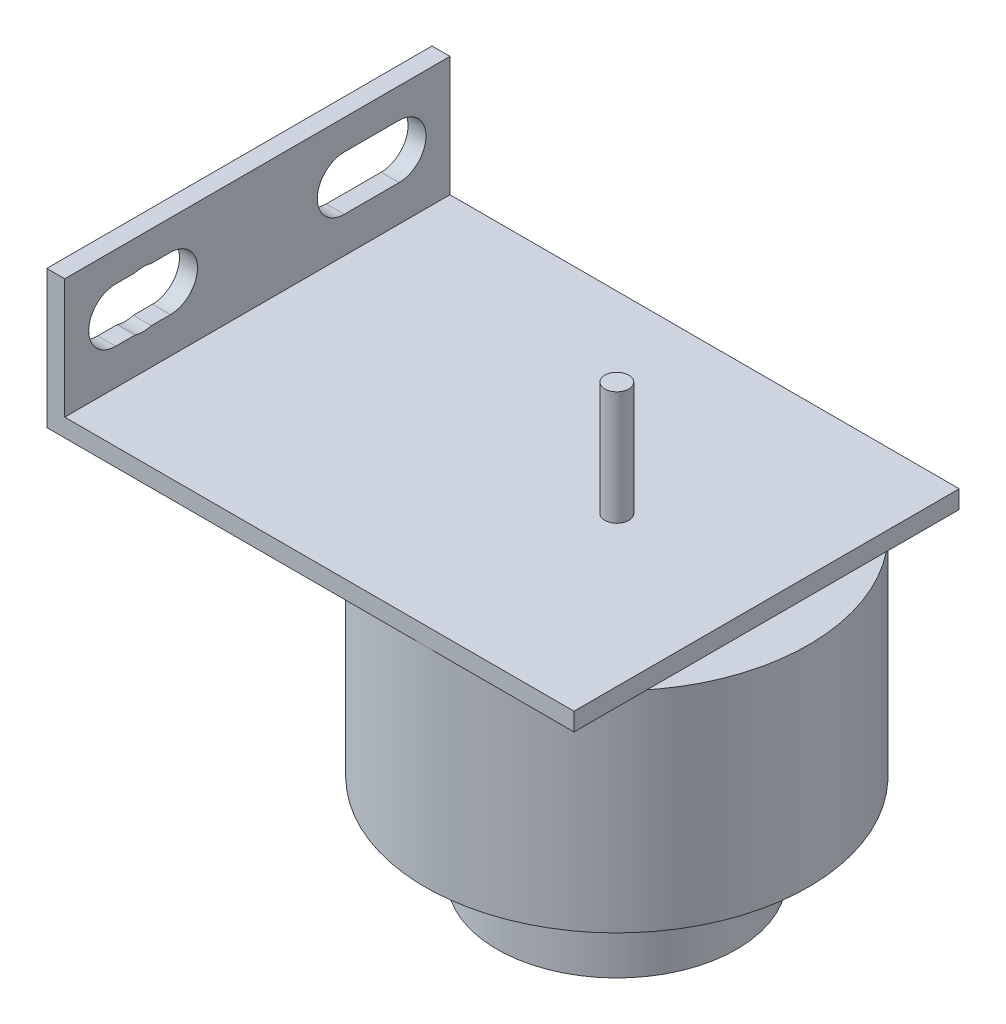
ISO-10303-21;
HEADER;
FILE_DESCRIPTION(('STEP AP214'),'2;1');
FILE_NAME('part.step','',(''),(''),'','','');
FILE_SCHEMA(('AUTOMOTIVE_DESIGN { 1 0 10303 214 1 1 1 1 }'));
ENDSEC;
DATA;
#1=APPLICATION_CONTEXT('core data for automotive mechanical design processes');
#2=APPLICATION_PROTOCOL_DEFINITION('international standard','automotive_design',2000,#1);
#3=PRODUCT_CONTEXT('',#1,'mechanical');
#4=PRODUCT('Part','Part','',(#3));
#5=PRODUCT_RELATED_PRODUCT_CATEGORY('part','',(#4));
#6=PRODUCT_DEFINITION_FORMATION('','',#4);
#7=PRODUCT_DEFINITION_CONTEXT('part definition',#1,'design');
#8=PRODUCT_DEFINITION('design','',#6,#7);
#9=PRODUCT_DEFINITION_SHAPE('','',#8);
#10=(LENGTH_UNIT() NAMED_UNIT(*) SI_UNIT(.MILLI.,.METRE.));
#11=(NAMED_UNIT(*) PLANE_ANGLE_UNIT() SI_UNIT($,.RADIAN.));
#12=(NAMED_UNIT(*) SI_UNIT($,.STERADIAN.) SOLID_ANGLE_UNIT());
#13=UNCERTAINTY_MEASURE_WITH_UNIT(LENGTH_MEASURE(1.E-05),#10,'distance_accuracy_value','');
#14=(GEOMETRIC_REPRESENTATION_CONTEXT(3) GLOBAL_UNCERTAINTY_ASSIGNED_CONTEXT((#13)) GLOBAL_UNIT_ASSIGNED_CONTEXT((#10,
#11,#12)) REPRESENTATION_CONTEXT('',''));
#15=CARTESIAN_POINT('',(0.,0.,0.));
#16=DIRECTION('',(0.,0.,1.));
#17=DIRECTION('',(1.,0.,0.));
#18=AXIS2_PLACEMENT_3D('',#15,#16,#17);
#19=CARTESIAN_POINT('',(31.5,-17.5,0.));
#20=DIRECTION('',(0.,1.,0.));
#21=DIRECTION('',(0.,0.,1.));
#22=AXIS2_PLACEMENT_3D('',#19,#20,#21);
#23=CYLINDRICAL_SURFACE('',#22,16.);
#24=CARTESIAN_POINT('',(31.5,-17.5,0.));
#25=DIRECTION('',(0.,-1.,0.));
#26=DIRECTION('',(0.,0.,-1.));
#27=AXIS2_PLACEMENT_3D('',#24,#25,#26);
#28=CIRCLE('',#27,16.);
#29=CARTESIAN_POINT('',(31.5,-17.5,-16.));
#30=VERTEX_POINT('',#29);
#31=EDGE_CURVE('E11',#30,#30,#28,.T.);
#32=ORIENTED_EDGE('',*,*,#31,.F.);
#33=EDGE_LOOP('',(#32));
#34=FACE_BOUND('',#33,.T.);
#35=CARTESIAN_POINT('',(31.5,0.,0.));
#36=DIRECTION('',(0.,-1.,0.));
#37=DIRECTION('',(0.,0.,-1.));
#38=AXIS2_PLACEMENT_3D('',#35,#36,#37);
#39=CIRCLE('',#38,16.);
#40=CARTESIAN_POINT('',(31.5,0.,-16.));
#41=VERTEX_POINT('',#40);
#42=EDGE_CURVE('E46',#41,#41,#39,.T.);
#43=ORIENTED_EDGE('',*,*,#42,.T.);
#44=EDGE_LOOP('',(#43));
#45=FACE_BOUND('',#44,.T.);
#46=ADVANCED_FACE('F43',(#34,#45),#23,.T.);
#47=CARTESIAN_POINT('',(31.5,-17.5,0.));
#48=DIRECTION('',(0.,-1.,0.));
#49=DIRECTION('',(0.,0.,-1.));
#50=AXIS2_PLACEMENT_3D('',#47,#48,#49);
#51=PLANE('',#50);
#52=CARTESIAN_POINT('',(31.5,-17.5,0.));
#53=DIRECTION('',(0.,-1.,0.));
#54=DIRECTION('',(0.,0.,-1.));
#55=AXIS2_PLACEMENT_3D('',#52,#53,#54);
#56=CIRCLE('',#55,10.);
#57=CARTESIAN_POINT('',(31.5,-17.5,-10.));
#58=VERTEX_POINT('',#57);
#59=EDGE_CURVE('E53',#58,#58,#56,.F.);
#60=ORIENTED_EDGE('',*,*,#59,.T.);
#61=EDGE_LOOP('',(#60));
#62=FACE_BOUND('',#61,.T.);
#63=ORIENTED_EDGE('',*,*,#31,.T.);
#64=EDGE_LOOP('',(#63));
#65=FACE_BOUND('',#64,.T.);
#66=ADVANCED_FACE('F73',(#62,#65),#51,.T.);
#67=CARTESIAN_POINT('',(31.5,0.,0.));
#68=DIRECTION('',(0.,-1.,0.));
#69=DIRECTION('',(0.,0.,-1.));
#70=AXIS2_PLACEMENT_3D('',#67,#68,#69);
#71=PLANE('',#70);
#72=ORIENTED_EDGE('',*,*,#42,.F.);
#73=EDGE_LOOP('',(#72));
#74=FACE_BOUND('',#73,.T.);
#75=ADVANCED_FACE('F65',(#74),#71,.F.);
#76=CARTESIAN_POINT('',(31.5,-25.,0.));
#77=DIRECTION('',(0.,1.,0.));
#78=DIRECTION('',(0.,0.,1.));
#79=AXIS2_PLACEMENT_3D('',#76,#77,#78);
#80=CYLINDRICAL_SURFACE('',#79,10.);
#81=ORIENTED_EDGE('',*,*,#59,.F.);
#82=EDGE_LOOP('',(#81));
#83=FACE_BOUND('',#82,.T.);
#84=CARTESIAN_POINT('',(31.5,-25.,0.));
#85=DIRECTION('',(0.,-1.,0.));
#86=DIRECTION('',(0.,0.,-1.));
#87=AXIS2_PLACEMENT_3D('',#84,#85,#86);
#88=CIRCLE('',#87,10.);
#89=CARTESIAN_POINT('',(31.5,-25.,-10.));
#90=VERTEX_POINT('',#89);
#91=EDGE_CURVE('E57',#90,#90,#88,.T.);
#92=ORIENTED_EDGE('',*,*,#91,.F.);
#93=EDGE_LOOP('',(#92));
#94=FACE_BOUND('',#93,.T.);
#95=ADVANCED_FACE('F63',(#83,#94),#80,.T.);
#96=CARTESIAN_POINT('',(31.5,-25.,0.));
#97=DIRECTION('',(0.,-1.,0.));
#98=DIRECTION('',(0.,0.,-1.));
#99=AXIS2_PLACEMENT_3D('',#96,#97,#98);
#100=PLANE('',#99);
#101=ORIENTED_EDGE('',*,*,#91,.T.);
#102=EDGE_LOOP('',(#101));
#103=FACE_BOUND('',#102,.T.);
#104=ADVANCED_FACE('F61',(#103),#100,.T.);
#105=CLOSED_SHELL('',(#46,#66,#75,#95,#104));
#106=MANIFOLD_SOLID_BREP('B2',#105);
#107=CARTESIAN_POINT('',(31.5,11.,0.));
#108=DIRECTION('',(0.,-1.,0.));
#109=DIRECTION('',(0.,0.,-1.));
#110=AXIS2_PLACEMENT_3D('',#107,#108,#109);
#111=CYLINDRICAL_SURFACE('',#110,0.999999999999998);
#112=CARTESIAN_POINT('',(31.5,11.,0.));
#113=DIRECTION('',(0.,1.,0.));
#114=DIRECTION('',(0.,0.,1.));
#115=AXIS2_PLACEMENT_3D('',#112,#113,#114);
#116=CIRCLE('',#115,0.999999999999998);
#117=CARTESIAN_POINT('',(31.5,11.,0.999999999999998));
#118=VERTEX_POINT('',#117);
#119=EDGE_CURVE('E42',#118,#118,#116,.T.);
#120=ORIENTED_EDGE('',*,*,#119,.F.);
#121=EDGE_LOOP('',(#120));
#122=FACE_BOUND('',#121,.T.);
#123=CARTESIAN_POINT('',(31.5,1.5,0.));
#124=DIRECTION('',(0.,1.,0.));
#125=DIRECTION('',(0.,0.,1.));
#126=AXIS2_PLACEMENT_3D('',#123,#124,#125);
#127=CIRCLE('',#126,0.999999999999998);
#128=CARTESIAN_POINT('',(31.5,1.5,0.999999999999998));
#129=VERTEX_POINT('',#128);
#130=EDGE_CURVE('E131',#129,#129,#127,.T.);
#131=ORIENTED_EDGE('',*,*,#130,.T.);
#132=EDGE_LOOP('',(#131));
#133=FACE_BOUND('',#132,.T.);
#134=ADVANCED_FACE('F128',(#122,#133),#111,.T.);
#135=CARTESIAN_POINT('',(31.5,11.,0.));
#136=DIRECTION('',(0.,1.,0.));
#137=DIRECTION('',(0.,0.,1.));
#138=AXIS2_PLACEMENT_3D('',#135,#136,#137);
#139=PLANE('',#138);
#140=ORIENTED_EDGE('',*,*,#119,.T.);
#141=EDGE_LOOP('',(#140));
#142=FACE_BOUND('',#141,.T.);
#143=ADVANCED_FACE('F143',(#142),#139,.T.);
#144=CARTESIAN_POINT('',(31.5,1.5,0.));
#145=DIRECTION('',(0.,1.,0.));
#146=DIRECTION('',(0.,0.,1.));
#147=AXIS2_PLACEMENT_3D('',#144,#145,#146);
#148=PLANE('',#147);
#149=ORIENTED_EDGE('',*,*,#130,.F.);
#150=EDGE_LOOP('',(#149));
#151=FACE_BOUND('',#150,.T.);
#152=ADVANCED_FACE('F141',(#151),#148,.F.);
#153=CLOSED_SHELL('',(#134,#143,#152));
#154=MANIFOLD_SOLID_BREP('B6',#153);
#155=CARTESIAN_POINT('',(3.,4.5,11.825));
#156=DIRECTION('',(0.,-1.,0.));
#157=DIRECTION('',(0.,0.,-1.));
#158=AXIS2_PLACEMENT_3D('',#155,#156,#157);
#159=PLANE('',#158);
#160=DIRECTION('',(0.,0.,-1.));
#161=VECTOR('',#160,1.);
#162=CARTESIAN_POINT('',(1.5,4.50000000000001,16.075));
#163=LINE('',#162,#161);
#164=CARTESIAN_POINT('',(1.5,4.5,11.825));
#165=VERTEX_POINT('',#164);
#166=CARTESIAN_POINT('',(1.5,4.5,10.2157329983124));
#167=VERTEX_POINT('',#166);
#168=EDGE_CURVE('E341',#165,#167,#163,.T.);
#169=ORIENTED_EDGE('',*,*,#168,.T.);
#170=DIRECTION('',(-1.,0.,0.));
#171=VECTOR('',#170,1.);
#172=CARTESIAN_POINT('',(47.5,4.5,10.2157329983124));
#173=LINE('',#172,#171);
#174=CARTESIAN_POINT('',(0.,4.5,10.2157329983124));
#175=VERTEX_POINT('',#174);
#176=EDGE_CURVE('E490',#167,#175,#173,.T.);
#177=ORIENTED_EDGE('',*,*,#176,.T.);
#178=DIRECTION('',(0.,0.,1.));
#179=VECTOR('',#178,1.);
#180=CARTESIAN_POINT('',(0.,4.5,11.825));
#181=LINE('',#180,#179);
#182=CARTESIAN_POINT('',(0.,4.5,11.825));
#183=VERTEX_POINT('',#182);
#184=EDGE_CURVE('E315',#175,#183,#181,.T.);
#185=ORIENTED_EDGE('',*,*,#184,.T.);
#186=DIRECTION('',(-1.,0.,0.));
#187=VECTOR('',#186,1.);
#188=CARTESIAN_POINT('',(3.,4.5,11.825));
#189=LINE('',#188,#187);
#190=EDGE_CURVE('E324',#165,#183,#189,.T.);
#191=ORIENTED_EDGE('',*,*,#190,.F.);
#192=EDGE_LOOP('',(#169,#177,#185,#191));
#193=FACE_BOUND('',#192,.T.);
#194=ADVANCED_FACE('F168',(#193),#159,.F.);
#195=CARTESIAN_POINT('',(3.,9.00000000000001,11.825));
#196=DIRECTION('',(0.,1.,0.));
#197=DIRECTION('',(0.,0.,1.));
#198=AXIS2_PLACEMENT_3D('',#195,#196,#197);
#199=PLANE('',#198);
#200=DIRECTION('',(0.,0.,1.));
#201=VECTOR('',#200,1.);
#202=CARTESIAN_POINT('',(1.5,9.00000000000001,16.075));
#203=LINE('',#202,#201);
#204=CARTESIAN_POINT('',(1.5,9.00000000000001,7.24999999999999));
#205=VERTEX_POINT('',#204);
#206=CARTESIAN_POINT('',(1.5,9.00000000000001,8.85926700168747));
#207=VERTEX_POINT('',#206);
#208=EDGE_CURVE('E334',#205,#207,#203,.T.);
#209=ORIENTED_EDGE('',*,*,#208,.T.);
#210=DIRECTION('',(-1.,0.,0.));
#211=VECTOR('',#210,1.);
#212=CARTESIAN_POINT('',(47.5,9.00000000000001,8.85926700168747));
#213=LINE('',#212,#211);
#214=CARTESIAN_POINT('',(0.,9.00000000000001,8.85926700168747));
#215=VERTEX_POINT('',#214);
#216=EDGE_CURVE('E126',#207,#215,#213,.T.);
#217=ORIENTED_EDGE('',*,*,#216,.T.);
#218=DIRECTION('',(0.,0.,-1.));
#219=VECTOR('',#218,1.);
#220=CARTESIAN_POINT('',(0.,9.00000000000001,11.825));
#221=LINE('',#220,#219);
#222=CARTESIAN_POINT('',(0.,9.00000000000001,7.24999999999999));
#223=VERTEX_POINT('',#222);
#224=EDGE_CURVE('E305',#215,#223,#221,.T.);
#225=ORIENTED_EDGE('',*,*,#224,.T.);
#226=DIRECTION('',(-1.,0.,0.));
#227=VECTOR('',#226,1.);
#228=CARTESIAN_POINT('',(3.,9.00000000000001,7.24999999999999));
#229=LINE('',#228,#227);
#230=EDGE_CURVE('E330',#205,#223,#229,.T.);
#231=ORIENTED_EDGE('',*,*,#230,.F.);
#232=EDGE_LOOP('',(#209,#217,#225,#231));
#233=FACE_BOUND('',#232,.T.);
#234=ADVANCED_FACE('F458',(#233),#199,.F.);
#235=CARTESIAN_POINT('',(0.,0.,16.075));
#236=DIRECTION('',(0.,1.,0.));
#237=DIRECTION('',(0.,0.,1.));
#238=AXIS2_PLACEMENT_3D('',#235,#236,#237);
#239=PLANE('',#238);
#240=DIRECTION('',(1.,0.,0.));
#241=VECTOR('',#240,1.);
#242=CARTESIAN_POINT('',(0.,0.,-16.075));
#243=LINE('',#242,#241);
#244=CARTESIAN_POINT('',(0.,0.,-16.075));
#245=VERTEX_POINT('',#244);
#246=CARTESIAN_POINT('',(44.,0.,-16.075));
#247=VERTEX_POINT('',#246);
#248=EDGE_CURVE('E375',#245,#247,#243,.T.);
#249=ORIENTED_EDGE('',*,*,#248,.T.);
#250=DIRECTION('',(0.,0.,-1.));
#251=VECTOR('',#250,1.);
#252=CARTESIAN_POINT('',(44.,0.,16.075));
#253=LINE('',#252,#251);
#254=CARTESIAN_POINT('',(44.,0.,16.075));
#255=VERTEX_POINT('',#254);
#256=EDGE_CURVE('E296',#255,#247,#253,.T.);
#257=ORIENTED_EDGE('',*,*,#256,.F.);
#258=DIRECTION('',(1.,0.,0.));
#259=VECTOR('',#258,1.);
#260=CARTESIAN_POINT('',(0.,0.,16.075));
#261=LINE('',#260,#259);
#262=CARTESIAN_POINT('',(0.,0.,16.075));
#263=VERTEX_POINT('',#262);
#264=EDGE_CURVE('E376',#263,#255,#261,.T.);
#265=ORIENTED_EDGE('',*,*,#264,.F.);
#266=DIRECTION('',(0.,0.,-1.));
#267=VECTOR('',#266,1.);
#268=CARTESIAN_POINT('',(0.,0.,16.075));
#269=LINE('',#268,#267);
#270=EDGE_CURVE('E393',#263,#245,#269,.T.);
#271=ORIENTED_EDGE('',*,*,#270,.T.);
#272=EDGE_LOOP('',(#249,#257,#265,#271));
#273=FACE_BOUND('',#272,.T.);
#274=ADVANCED_FACE('F170',(#273),#239,.F.);
#275=CARTESIAN_POINT('',(44.,1.5,16.075));
#276=DIRECTION('',(1.,0.,0.));
#277=DIRECTION('',(0.,0.,-1.));
#278=AXIS2_PLACEMENT_3D('',#275,#276,#277);
#279=PLANE('',#278);
#280=DIRECTION('',(0.,-1.,0.));
#281=VECTOR('',#280,1.);
#282=CARTESIAN_POINT('',(44.,1.5,-16.075));
#283=LINE('',#282,#281);
#284=CARTESIAN_POINT('',(44.,1.5,-16.075));
#285=VERTEX_POINT('',#284);
#286=EDGE_CURVE('E396',#285,#247,#283,.T.);
#287=ORIENTED_EDGE('',*,*,#286,.F.);
#288=DIRECTION('',(0.,0.,-1.));
#289=VECTOR('',#288,1.);
#290=CARTESIAN_POINT('',(44.,1.5,16.075));
#291=LINE('',#290,#289);
#292=CARTESIAN_POINT('',(44.,1.5,16.075));
#293=VERTEX_POINT('',#292);
#294=EDGE_CURVE('E417',#293,#285,#291,.T.);
#295=ORIENTED_EDGE('',*,*,#294,.F.);
#296=DIRECTION('',(0.,-1.,0.));
#297=VECTOR('',#296,1.);
#298=CARTESIAN_POINT('',(44.,1.5,16.075));
#299=LINE('',#298,#297);
#300=EDGE_CURVE('E378',#293,#255,#299,.T.);
#301=ORIENTED_EDGE('',*,*,#300,.T.);
#302=ORIENTED_EDGE('',*,*,#256,.T.);
#303=EDGE_LOOP('',(#287,#295,#301,#302));
#304=FACE_BOUND('',#303,.T.);
#305=ADVANCED_FACE('F422',(#304),#279,.T.);
#306=CARTESIAN_POINT('',(0.,1.5,16.075));
#307=DIRECTION('',(0.,1.,0.));
#308=DIRECTION('',(0.,0.,1.));
#309=AXIS2_PLACEMENT_3D('',#306,#307,#308);
#310=PLANE('',#309);
#311=DIRECTION('',(1.,0.,0.));
#312=VECTOR('',#311,1.);
#313=CARTESIAN_POINT('',(0.,1.5,-16.075));
#314=LINE('',#313,#312);
#315=CARTESIAN_POINT('',(1.5,1.5,-16.075));
#316=VERTEX_POINT('',#315);
#317=EDGE_CURVE('E399',#316,#285,#314,.T.);
#318=ORIENTED_EDGE('',*,*,#317,.F.);
#319=DIRECTION('',(0.,0.,-1.));
#320=VECTOR('',#319,1.);
#321=CARTESIAN_POINT('',(1.5,1.5,16.075));
#322=LINE('',#321,#320);
#323=CARTESIAN_POINT('',(1.5,1.5,16.075));
#324=VERTEX_POINT('',#323);
#325=EDGE_CURVE('E415',#324,#316,#322,.T.);
#326=ORIENTED_EDGE('',*,*,#325,.F.);
#327=DIRECTION('',(1.,0.,0.));
#328=VECTOR('',#327,1.);
#329=CARTESIAN_POINT('',(0.,1.5,16.075));
#330=LINE('',#329,#328);
#331=EDGE_CURVE('E382',#324,#293,#330,.T.);
#332=ORIENTED_EDGE('',*,*,#331,.T.);
#333=ORIENTED_EDGE('',*,*,#294,.T.);
#334=EDGE_LOOP('',(#318,#326,#332,#333));
#335=FACE_BOUND('',#334,.T.);
#336=ADVANCED_FACE('F434',(#335),#310,.T.);
#337=CARTESIAN_POINT('',(1.5,11.5,16.075));
#338=DIRECTION('',(1.,0.,0.));
#339=DIRECTION('',(0.,0.,-1.));
#340=AXIS2_PLACEMENT_3D('',#337,#338,#339);
#341=PLANE('',#340);
#342=CARTESIAN_POINT('',(1.5,6.75000000000003,9.5375));
#343=DIRECTION('',(1.,0.,0.));
#344=DIRECTION('',(0.,0.,-1.));
#345=AXIS2_PLACEMENT_3D('',#342,#343,#344);
#346=CIRCLE('',#345,2.34999999999999);
#347=CARTESIAN_POINT('',(1.5,9.00000000000001,10.2157329983125));
#348=VERTEX_POINT('',#347);
#349=EDGE_CURVE('E191',#207,#348,#346,.T.);
#350=ORIENTED_EDGE('',*,*,#349,.F.);
#351=ORIENTED_EDGE('',*,*,#208,.F.);
#352=CARTESIAN_POINT('',(1.5,6.75000000000003,7.24999999999999));
#353=DIRECTION('',(1.,0.,0.));
#354=DIRECTION('',(0.,0.,-1.));
#355=AXIS2_PLACEMENT_3D('',#352,#353,#354);
#356=CIRCLE('',#355,2.25);
#357=CARTESIAN_POINT('',(1.5,4.50000000000002,7.24999999999999));
#358=VERTEX_POINT('',#357);
#359=EDGE_CURVE('E337',#358,#205,#356,.T.);
#360=ORIENTED_EDGE('',*,*,#359,.F.);
#361=CARTESIAN_POINT('',(1.5,4.5,8.8592670016876));
#362=VERTEX_POINT('',#361);
#363=EDGE_CURVE('E340',#362,#358,#163,.T.);
#364=ORIENTED_EDGE('',*,*,#363,.F.);
#365=EDGE_CURVE('E183',#167,#362,#346,.T.);
#366=ORIENTED_EDGE('',*,*,#365,.F.);
#367=ORIENTED_EDGE('',*,*,#168,.F.);
#368=CARTESIAN_POINT('',(1.5,6.75000000000001,11.825));
#369=DIRECTION('',(1.,0.,0.));
#370=DIRECTION('',(0.,0.,-1.));
#371=AXIS2_PLACEMENT_3D('',#368,#369,#370);
#372=CIRCLE('',#371,2.25);
#373=CARTESIAN_POINT('',(1.5,9.00000000000001,11.825));
#374=VERTEX_POINT('',#373);
#375=EDGE_CURVE('E344',#374,#165,#372,.T.);
#376=ORIENTED_EDGE('',*,*,#375,.F.);
#377=EDGE_CURVE('E327',#348,#374,#203,.T.);
#378=ORIENTED_EDGE('',*,*,#377,.F.);
#379=EDGE_LOOP('',(#350,#351,#360,#364,#366,#367,#376,#378));
#380=FACE_BOUND('',#379,.T.);
#381=CARTESIAN_POINT('',(1.5,6.75000000000001,-11.825));
#382=DIRECTION('',(1.,0.,0.));
#383=DIRECTION('',(0.,0.,-1.));
#384=AXIS2_PLACEMENT_3D('',#381,#382,#383);
#385=CIRCLE('',#384,2.25);
#386=CARTESIAN_POINT('',(1.5,4.5,-11.825));
#387=VERTEX_POINT('',#386);
#388=CARTESIAN_POINT('',(1.5,9.00000000000001,-11.825));
#389=VERTEX_POINT('',#388);
#390=EDGE_CURVE('E373',#387,#389,#385,.T.);
#391=ORIENTED_EDGE('',*,*,#390,.F.);
#392=DIRECTION('',(0.,0.,-1.));
#393=VECTOR('',#392,1.);
#394=CARTESIAN_POINT('',(1.5,4.49999999999999,16.075));
#395=LINE('',#394,#393);
#396=CARTESIAN_POINT('',(1.5,4.5,-7.24999999999999));
#397=VERTEX_POINT('',#396);
#398=EDGE_CURVE('E360',#397,#387,#395,.T.);
#399=ORIENTED_EDGE('',*,*,#398,.F.);
#400=CARTESIAN_POINT('',(1.5,6.75000000000003,-7.24999999999999));
#401=DIRECTION('',(1.,0.,0.));
#402=DIRECTION('',(0.,0.,-1.));
#403=AXIS2_PLACEMENT_3D('',#400,#401,#402);
#404=CIRCLE('',#403,2.25);
#405=CARTESIAN_POINT('',(1.5,9.00000000000001,-7.24999999999999));
#406=VERTEX_POINT('',#405);
#407=EDGE_CURVE('E368',#406,#397,#404,.T.);
#408=ORIENTED_EDGE('',*,*,#407,.F.);
#409=DIRECTION('',(0.,0.,1.));
#410=VECTOR('',#409,1.);
#411=CARTESIAN_POINT('',(1.5,9.00000000000001,16.075));
#412=LINE('',#411,#410);
#413=EDGE_CURVE('E371',#389,#406,#412,.T.);
#414=ORIENTED_EDGE('',*,*,#413,.F.);
#415=EDGE_LOOP('',(#391,#399,#408,#414));
#416=FACE_BOUND('',#415,.T.);
#417=DIRECTION('',(0.,1.,0.));
#418=VECTOR('',#417,1.);
#419=CARTESIAN_POINT('',(1.5,11.5,-16.075));
#420=LINE('',#419,#418);
#421=CARTESIAN_POINT('',(1.5,11.5,-16.075));
#422=VERTEX_POINT('',#421);
#423=EDGE_CURVE('E402',#422,#316,#420,.F.);
#424=ORIENTED_EDGE('',*,*,#423,.F.);
#425=DIRECTION('',(0.,0.,-1.));
#426=VECTOR('',#425,1.);
#427=CARTESIAN_POINT('',(1.5,11.5,16.075));
#428=LINE('',#427,#426);
#429=CARTESIAN_POINT('',(1.5,11.5,16.075));
#430=VERTEX_POINT('',#429);
#431=EDGE_CURVE('E413',#430,#422,#428,.T.);
#432=ORIENTED_EDGE('',*,*,#431,.F.);
#433=DIRECTION('',(0.,1.,0.));
#434=VECTOR('',#433,1.);
#435=CARTESIAN_POINT('',(1.5,11.5,16.075));
#436=LINE('',#435,#434);
#437=EDGE_CURVE('E385',#430,#324,#436,.F.);
#438=ORIENTED_EDGE('',*,*,#437,.T.);
#439=ORIENTED_EDGE('',*,*,#325,.T.);
#440=EDGE_LOOP('',(#424,#432,#438,#439));
#441=FACE_BOUND('',#440,.T.);
#442=ADVANCED_FACE('F446',(#380,#416,#441),#341,.T.);
#443=CARTESIAN_POINT('',(0.,11.5,16.075));
#444=DIRECTION('',(0.,1.,0.));
#445=DIRECTION('',(0.,0.,1.));
#446=AXIS2_PLACEMENT_3D('',#443,#444,#445);
#447=PLANE('',#446);
#448=DIRECTION('',(1.,0.,0.));
#449=VECTOR('',#448,1.);
#450=CARTESIAN_POINT('',(0.,11.5,-16.075));
#451=LINE('',#450,#449);
#452=CARTESIAN_POINT('',(0.,11.5,-16.075));
#453=VERTEX_POINT('',#452);
#454=EDGE_CURVE('E405',#453,#422,#451,.T.);
#455=ORIENTED_EDGE('',*,*,#454,.F.);
#456=DIRECTION('',(0.,0.,-1.));
#457=VECTOR('',#456,1.);
#458=CARTESIAN_POINT('',(0.,11.5,16.075));
#459=LINE('',#458,#457);
#460=CARTESIAN_POINT('',(0.,11.5,16.075));
#461=VERTEX_POINT('',#460);
#462=EDGE_CURVE('E411',#461,#453,#459,.T.);
#463=ORIENTED_EDGE('',*,*,#462,.F.);
#464=DIRECTION('',(1.,0.,0.));
#465=VECTOR('',#464,1.);
#466=CARTESIAN_POINT('',(0.,11.5,16.075));
#467=LINE('',#466,#465);
#468=EDGE_CURVE('E388',#461,#430,#467,.T.);
#469=ORIENTED_EDGE('',*,*,#468,.T.);
#470=ORIENTED_EDGE('',*,*,#431,.T.);
#471=EDGE_LOOP('',(#455,#463,#469,#470));
#472=FACE_BOUND('',#471,.T.);
#473=ADVANCED_FACE('F444',(#472),#447,.T.);
#474=CARTESIAN_POINT('',(0.,11.5,16.075));
#475=DIRECTION('',(1.,0.,0.));
#476=DIRECTION('',(0.,0.,-1.));
#477=AXIS2_PLACEMENT_3D('',#474,#475,#476);
#478=PLANE('',#477);
#479=ORIENTED_EDGE('',*,*,#224,.F.);
#480=CARTESIAN_POINT('',(0.,6.75000000000003,9.5375));
#481=DIRECTION('',(-1.,0.,0.));
#482=DIRECTION('',(0.,0.,1.));
#483=AXIS2_PLACEMENT_3D('',#480,#481,#482);
#484=CIRCLE('',#483,2.34999999999999);
#485=CARTESIAN_POINT('',(0.,9.00000000000001,10.2157329983125));
#486=VERTEX_POINT('',#485);
#487=EDGE_CURVE('E292',#486,#215,#484,.T.);
#488=ORIENTED_EDGE('',*,*,#487,.F.);
#489=CARTESIAN_POINT('',(0.,9.00000000000001,11.825));
#490=VERTEX_POINT('',#489);
#491=EDGE_CURVE('E303',#490,#486,#221,.T.);
#492=ORIENTED_EDGE('',*,*,#491,.F.);
#493=CARTESIAN_POINT('',(0.,6.75000000000001,11.825));
#494=DIRECTION('',(-1.,0.,0.));
#495=DIRECTION('',(0.,0.,-1.));
#496=AXIS2_PLACEMENT_3D('',#493,#494,#495);
#497=CIRCLE('',#496,2.25);
#498=EDGE_CURVE('E317',#183,#490,#497,.T.);
#499=ORIENTED_EDGE('',*,*,#498,.F.);
#500=ORIENTED_EDGE('',*,*,#184,.F.);
#501=CARTESIAN_POINT('',(0.,4.5,8.8592670016876));
#502=VERTEX_POINT('',#501);
#503=EDGE_CURVE('E306',#502,#175,#484,.T.);
#504=ORIENTED_EDGE('',*,*,#503,.F.);
#505=CARTESIAN_POINT('',(0.,4.50000000000002,7.24999999999999));
#506=VERTEX_POINT('',#505);
#507=EDGE_CURVE('E321',#506,#502,#181,.T.);
#508=ORIENTED_EDGE('',*,*,#507,.F.);
#509=CARTESIAN_POINT('',(0.,6.75000000000003,7.24999999999999));
#510=DIRECTION('',(-1.,0.,0.));
#511=DIRECTION('',(0.,0.,-1.));
#512=AXIS2_PLACEMENT_3D('',#509,#510,#511);
#513=CIRCLE('',#512,2.25);
#514=EDGE_CURVE('E312',#223,#506,#513,.T.);
#515=ORIENTED_EDGE('',*,*,#514,.F.);
#516=EDGE_LOOP('',(#479,#488,#492,#499,#500,#504,#508,#515));
#517=FACE_BOUND('',#516,.T.);
#518=DIRECTION('',(0.,0.,1.));
#519=VECTOR('',#518,1.);
#520=CARTESIAN_POINT('',(0.,4.5,-11.825));
#521=LINE('',#520,#519);
#522=CARTESIAN_POINT('',(0.,4.5,-11.825));
#523=VERTEX_POINT('',#522);
#524=CARTESIAN_POINT('',(0.,4.50000000000002,-7.24999999999999));
#525=VERTEX_POINT('',#524);
#526=EDGE_CURVE('E348',#523,#525,#521,.T.);
#527=ORIENTED_EDGE('',*,*,#526,.F.);
#528=CARTESIAN_POINT('',(0.,6.75000000000001,-11.825));
#529=DIRECTION('',(-1.,0.,0.));
#530=DIRECTION('',(0.,0.,1.));
#531=AXIS2_PLACEMENT_3D('',#528,#529,#530);
#532=CIRCLE('',#531,2.25);
#533=CARTESIAN_POINT('',(0.,9.00000000000001,-11.825));
#534=VERTEX_POINT('',#533);
#535=EDGE_CURVE('E346',#534,#523,#532,.T.);
#536=ORIENTED_EDGE('',*,*,#535,.F.);
#537=DIRECTION('',(0.,0.,-1.));
#538=VECTOR('',#537,1.);
#539=CARTESIAN_POINT('',(0.,9.00000000000001,-11.825));
#540=LINE('',#539,#538);
#541=CARTESIAN_POINT('',(0.,9.00000000000001,-7.24999999999999));
#542=VERTEX_POINT('',#541);
#543=EDGE_CURVE('E354',#542,#534,#540,.T.);
#544=ORIENTED_EDGE('',*,*,#543,.F.);
#545=CARTESIAN_POINT('',(0.,6.75000000000003,-7.24999999999999));
#546=DIRECTION('',(-1.,0.,0.));
#547=DIRECTION('',(0.,0.,1.));
#548=AXIS2_PLACEMENT_3D('',#545,#546,#547);
#549=CIRCLE('',#548,2.25);
#550=EDGE_CURVE('E351',#525,#542,#549,.T.);
#551=ORIENTED_EDGE('',*,*,#550,.F.);
#552=EDGE_LOOP('',(#527,#536,#544,#551));
#553=FACE_BOUND('',#552,.T.);
#554=DIRECTION('',(0.,-1.,0.));
#555=VECTOR('',#554,1.);
#556=CARTESIAN_POINT('',(0.,11.5,-16.075));
#557=LINE('',#556,#555);
#558=EDGE_CURVE('E379',#453,#245,#557,.T.);
#559=ORIENTED_EDGE('',*,*,#558,.T.);
#560=ORIENTED_EDGE('',*,*,#270,.F.);
#561=DIRECTION('',(0.,-1.,0.));
#562=VECTOR('',#561,1.);
#563=CARTESIAN_POINT('',(0.,11.5,16.075));
#564=LINE('',#563,#562);
#565=EDGE_CURVE('E391',#461,#263,#564,.T.);
#566=ORIENTED_EDGE('',*,*,#565,.F.);
#567=ORIENTED_EDGE('',*,*,#462,.T.);
#568=EDGE_LOOP('',(#559,#560,#566,#567));
#569=FACE_BOUND('',#568,.T.);
#570=ADVANCED_FACE('F300',(#517,#553,#569),#478,.F.);
#571=CARTESIAN_POINT('',(0.,0.,16.075));
#572=DIRECTION('',(0.,0.,-1.));
#573=DIRECTION('',(-1.,0.,0.));
#574=AXIS2_PLACEMENT_3D('',#571,#572,#573);
#575=PLANE('',#574);
#576=ORIENTED_EDGE('',*,*,#264,.T.);
#577=ORIENTED_EDGE('',*,*,#300,.F.);
#578=ORIENTED_EDGE('',*,*,#331,.F.);
#579=ORIENTED_EDGE('',*,*,#437,.F.);
#580=ORIENTED_EDGE('',*,*,#468,.F.);
#581=ORIENTED_EDGE('',*,*,#565,.T.);
#582=EDGE_LOOP('',(#576,#577,#578,#579,#580,#581));
#583=FACE_BOUND('',#582,.T.);
#584=ADVANCED_FACE('F437',(#583),#575,.F.);
#585=CARTESIAN_POINT('',(0.,0.,-16.075));
#586=DIRECTION('',(0.,0.,-1.));
#587=DIRECTION('',(-1.,0.,0.));
#588=AXIS2_PLACEMENT_3D('',#585,#586,#587);
#589=PLANE('',#588);
#590=ORIENTED_EDGE('',*,*,#248,.F.);
#591=ORIENTED_EDGE('',*,*,#558,.F.);
#592=ORIENTED_EDGE('',*,*,#454,.T.);
#593=ORIENTED_EDGE('',*,*,#423,.T.);
#594=ORIENTED_EDGE('',*,*,#317,.T.);
#595=ORIENTED_EDGE('',*,*,#286,.T.);
#596=EDGE_LOOP('',(#590,#591,#592,#593,#594,#595));
#597=FACE_BOUND('',#596,.T.);
#598=ADVANCED_FACE('F430',(#597),#589,.T.);
#599=CARTESIAN_POINT('',(3.,6.75000000000001,-11.825));
#600=DIRECTION('',(-1.,0.,0.));
#601=DIRECTION('',(0.,0.,1.));
#602=AXIS2_PLACEMENT_3D('',#599,#600,#601);
#603=CYLINDRICAL_SURFACE('',#602,2.25);
#604=ORIENTED_EDGE('',*,*,#390,.T.);
#605=DIRECTION('',(-1.,0.,0.));
#606=VECTOR('',#605,1.);
#607=CARTESIAN_POINT('',(3.,9.00000000000001,-11.825));
#608=LINE('',#607,#606);
#609=EDGE_CURVE('E358',#389,#534,#608,.T.);
#610=ORIENTED_EDGE('',*,*,#609,.T.);
#611=ORIENTED_EDGE('',*,*,#535,.T.);
#612=DIRECTION('',(-1.,0.,0.));
#613=VECTOR('',#612,1.);
#614=CARTESIAN_POINT('',(3.,4.5,-11.825));
#615=LINE('',#614,#613);
#616=EDGE_CURVE('E357',#387,#523,#615,.T.);
#617=ORIENTED_EDGE('',*,*,#616,.F.);
#618=EDGE_LOOP('',(#604,#610,#611,#617));
#619=FACE_BOUND('',#618,.T.);
#620=ADVANCED_FACE('F511',(#619),#603,.F.);
#621=CARTESIAN_POINT('',(3.,9.00000000000001,-11.825));
#622=DIRECTION('',(0.,1.,0.));
#623=DIRECTION('',(0.,0.,1.));
#624=AXIS2_PLACEMENT_3D('',#621,#622,#623);
#625=PLANE('',#624);
#626=ORIENTED_EDGE('',*,*,#413,.T.);
#627=DIRECTION('',(-1.,0.,0.));
#628=VECTOR('',#627,1.);
#629=CARTESIAN_POINT('',(3.,9.00000000000001,-7.24999999999999));
#630=LINE('',#629,#628);
#631=EDGE_CURVE('E361',#406,#542,#630,.T.);
#632=ORIENTED_EDGE('',*,*,#631,.T.);
#633=ORIENTED_EDGE('',*,*,#543,.T.);
#634=ORIENTED_EDGE('',*,*,#609,.F.);
#635=EDGE_LOOP('',(#626,#632,#633,#634));
#636=FACE_BOUND('',#635,.T.);
#637=ADVANCED_FACE('F507',(#636),#625,.F.);
#638=CARTESIAN_POINT('',(3.,6.75000000000003,-7.24999999999999));
#639=DIRECTION('',(-1.,0.,0.));
#640=DIRECTION('',(0.,0.,1.));
#641=AXIS2_PLACEMENT_3D('',#638,#639,#640);
#642=CYLINDRICAL_SURFACE('',#641,2.25);
#643=ORIENTED_EDGE('',*,*,#407,.T.);
#644=DIRECTION('',(-1.,0.,0.));
#645=VECTOR('',#644,1.);
#646=CARTESIAN_POINT('',(3.,4.50000000000002,-7.24999999999999));
#647=LINE('',#646,#645);
#648=EDGE_CURVE('E363',#397,#525,#647,.T.);
#649=ORIENTED_EDGE('',*,*,#648,.T.);
#650=ORIENTED_EDGE('',*,*,#550,.T.);
#651=ORIENTED_EDGE('',*,*,#631,.F.);
#652=EDGE_LOOP('',(#643,#649,#650,#651));
#653=FACE_BOUND('',#652,.T.);
#654=ADVANCED_FACE('F510',(#653),#642,.F.);
#655=CARTESIAN_POINT('',(3.,4.5,-11.825));
#656=DIRECTION('',(0.,-1.,0.));
#657=DIRECTION('',(0.,0.,-1.));
#658=AXIS2_PLACEMENT_3D('',#655,#656,#657);
#659=PLANE('',#658);
#660=ORIENTED_EDGE('',*,*,#398,.T.);
#661=ORIENTED_EDGE('',*,*,#616,.T.);
#662=ORIENTED_EDGE('',*,*,#526,.T.);
#663=ORIENTED_EDGE('',*,*,#648,.F.);
#664=EDGE_LOOP('',(#660,#661,#662,#663));
#665=FACE_BOUND('',#664,.T.);
#666=ADVANCED_FACE('F478',(#665),#659,.F.);
#667=CARTESIAN_POINT('',(3.,6.75000000000001,11.825));
#668=DIRECTION('',(-1.,0.,0.));
#669=DIRECTION('',(0.,0.,1.));
#670=AXIS2_PLACEMENT_3D('',#667,#668,#669);
#671=CYLINDRICAL_SURFACE('',#670,2.25);
#672=ORIENTED_EDGE('',*,*,#375,.T.);
#673=ORIENTED_EDGE('',*,*,#190,.T.);
#674=ORIENTED_EDGE('',*,*,#498,.T.);
#675=DIRECTION('',(-1.,0.,0.));
#676=VECTOR('',#675,1.);
#677=CARTESIAN_POINT('',(3.,9.00000000000001,11.825));
#678=LINE('',#677,#676);
#679=EDGE_CURVE('E311',#374,#490,#678,.T.);
#680=ORIENTED_EDGE('',*,*,#679,.F.);
#681=EDGE_LOOP('',(#672,#673,#674,#680));
#682=FACE_BOUND('',#681,.T.);
#683=ADVANCED_FACE('F471',(#682),#671,.F.);
#684=ORIENTED_EDGE('',*,*,#507,.T.);
#685=DIRECTION('',(-1.,0.,0.));
#686=VECTOR('',#685,1.);
#687=CARTESIAN_POINT('',(47.5,4.5,8.8592670016876));
#688=LINE('',#687,#686);
#689=EDGE_CURVE('E482',#502,#362,#688,.F.);
#690=ORIENTED_EDGE('',*,*,#689,.T.);
#691=ORIENTED_EDGE('',*,*,#363,.T.);
#692=DIRECTION('',(-1.,0.,0.));
#693=VECTOR('',#692,1.);
#694=CARTESIAN_POINT('',(3.,4.50000000000002,7.24999999999999));
#695=LINE('',#694,#693);
#696=EDGE_CURVE('E328',#358,#506,#695,.T.);
#697=ORIENTED_EDGE('',*,*,#696,.T.);
#698=EDGE_LOOP('',(#684,#690,#691,#697));
#699=FACE_BOUND('',#698,.T.);
#700=ADVANCED_FACE('F461',(#699),#159,.F.);
#701=CARTESIAN_POINT('',(3.,6.75000000000003,7.24999999999999));
#702=DIRECTION('',(-1.,0.,0.));
#703=DIRECTION('',(0.,0.,1.));
#704=AXIS2_PLACEMENT_3D('',#701,#702,#703);
#705=CYLINDRICAL_SURFACE('',#704,2.25);
#706=ORIENTED_EDGE('',*,*,#359,.T.);
#707=ORIENTED_EDGE('',*,*,#230,.T.);
#708=ORIENTED_EDGE('',*,*,#514,.T.);
#709=ORIENTED_EDGE('',*,*,#696,.F.);
#710=EDGE_LOOP('',(#706,#707,#708,#709));
#711=FACE_BOUND('',#710,.T.);
#712=ADVANCED_FACE('F470',(#711),#705,.F.);
#713=ORIENTED_EDGE('',*,*,#491,.T.);
#714=DIRECTION('',(-1.,0.,0.));
#715=VECTOR('',#714,1.);
#716=CARTESIAN_POINT('',(47.5,9.00000000000001,10.2157329983125));
#717=LINE('',#716,#715);
#718=EDGE_CURVE('E176',#486,#348,#717,.F.);
#719=ORIENTED_EDGE('',*,*,#718,.T.);
#720=ORIENTED_EDGE('',*,*,#377,.T.);
#721=ORIENTED_EDGE('',*,*,#679,.T.);
#722=EDGE_LOOP('',(#713,#719,#720,#721));
#723=FACE_BOUND('',#722,.T.);
#724=ADVANCED_FACE('F309',(#723),#199,.F.);
#725=CARTESIAN_POINT('',(47.5,6.75000000000003,9.5375));
#726=DIRECTION('',(-1.,0.,0.));
#727=DIRECTION('',(0.,0.,1.));
#728=AXIS2_PLACEMENT_3D('',#725,#726,#727);
#729=CYLINDRICAL_SURFACE('',#728,2.34999999999999);
#730=ORIENTED_EDGE('',*,*,#349,.T.);
#731=ORIENTED_EDGE('',*,*,#718,.F.);
#732=ORIENTED_EDGE('',*,*,#487,.T.);
#733=ORIENTED_EDGE('',*,*,#216,.F.);
#734=EDGE_LOOP('',(#730,#731,#732,#733));
#735=FACE_BOUND('',#734,.T.);
#736=ADVANCED_FACE('F291',(#735),#729,.F.);
#737=ORIENTED_EDGE('',*,*,#365,.T.);
#738=ORIENTED_EDGE('',*,*,#689,.F.);
#739=ORIENTED_EDGE('',*,*,#503,.T.);
#740=ORIENTED_EDGE('',*,*,#176,.F.);
#741=EDGE_LOOP('',(#737,#738,#739,#740));
#742=FACE_BOUND('',#741,.T.);
#743=ADVANCED_FACE('F496',(#742),#729,.F.);
#744=CLOSED_SHELL('',(#194,#234,#274,#305,#336,#442,#473,#570,#584,#598,#620,#637,#654,#666,
#683,#700,#712,#724,#736,#743));
#745=MANIFOLD_SOLID_BREP('B37',#744);
#746=ADVANCED_BREP_SHAPE_REPRESENTATION('',(#18,#106,#154,#745),#14);
#747=SHAPE_DEFINITION_REPRESENTATION(#9,#746);
ENDSEC;
END-ISO-10303-21;
